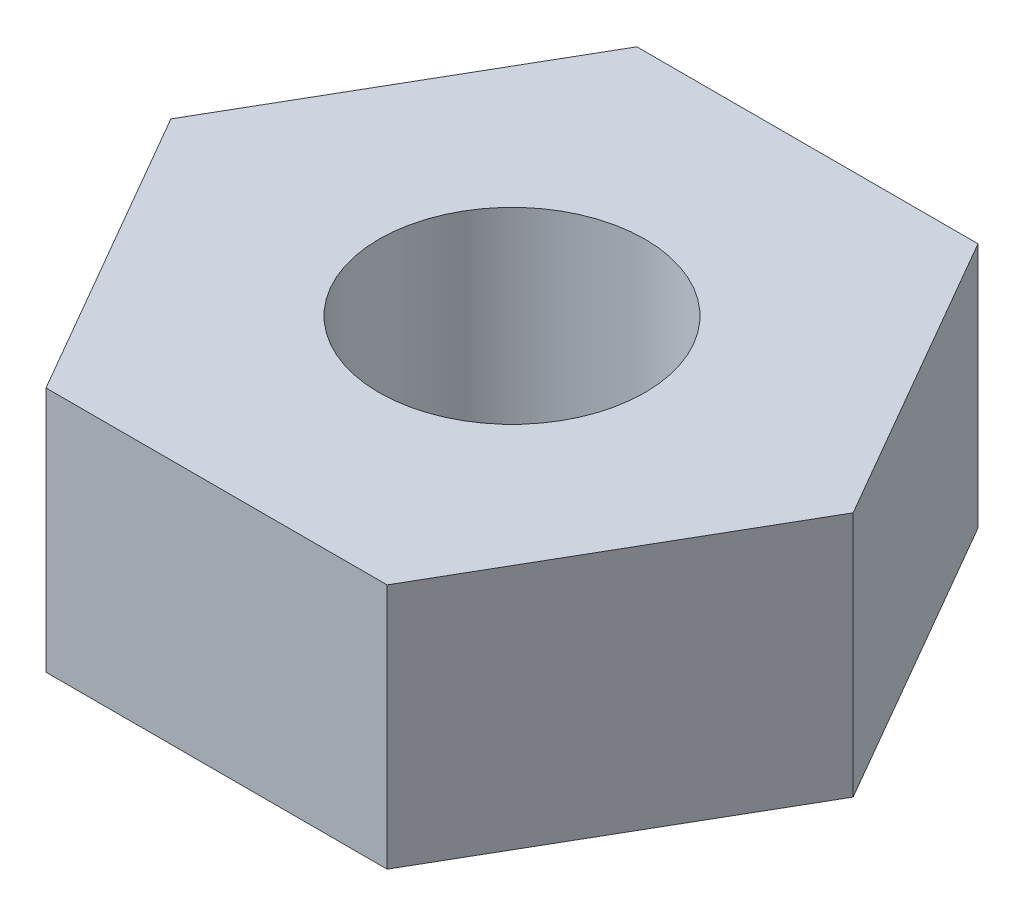
ISO-10303-21;
HEADER;
FILE_DESCRIPTION(('STEP AP214'),'2;1');
FILE_NAME('part.step','',(''),(''),'','','');
FILE_SCHEMA(('AUTOMOTIVE_DESIGN { 1 0 10303 214 1 1 1 1 }'));
ENDSEC;
DATA;
#1=APPLICATION_CONTEXT('core data for automotive mechanical design processes');
#2=APPLICATION_PROTOCOL_DEFINITION('international standard','automotive_design',2000,#1);
#3=PRODUCT_CONTEXT('',#1,'mechanical');
#4=PRODUCT('Part','Part','',(#3));
#5=PRODUCT_RELATED_PRODUCT_CATEGORY('part','',(#4));
#6=PRODUCT_DEFINITION_FORMATION('','',#4);
#7=PRODUCT_DEFINITION_CONTEXT('part definition',#1,'design');
#8=PRODUCT_DEFINITION('design','',#6,#7);
#9=PRODUCT_DEFINITION_SHAPE('','',#8);
#10=(LENGTH_UNIT() NAMED_UNIT(*) SI_UNIT(.MILLI.,.METRE.));
#11=(NAMED_UNIT(*) PLANE_ANGLE_UNIT() SI_UNIT($,.RADIAN.));
#12=(NAMED_UNIT(*) SI_UNIT($,.STERADIAN.) SOLID_ANGLE_UNIT());
#13=UNCERTAINTY_MEASURE_WITH_UNIT(LENGTH_MEASURE(1.E-05),#10,'distance_accuracy_value','');
#14=(GEOMETRIC_REPRESENTATION_CONTEXT(3) GLOBAL_UNCERTAINTY_ASSIGNED_CONTEXT((#13)) GLOBAL_UNIT_ASSIGNED_CONTEXT((#10,
#11,#12)) REPRESENTATION_CONTEXT('',''));
#15=CARTESIAN_POINT('',(0.,0.,0.));
#16=DIRECTION('',(0.,0.,1.));
#17=DIRECTION('',(1.,0.,0.));
#18=AXIS2_PLACEMENT_3D('',#15,#16,#17);
#19=CARTESIAN_POINT('',(0.,2.5,0.));
#20=DIRECTION('',(0.,1.,0.));
#21=DIRECTION('',(0.,0.,1.));
#22=AXIS2_PLACEMENT_3D('',#19,#20,#21);
#23=PLANE('',#22);
#24=DIRECTION('',(0.499999999999995,0.,-0.866025403784442));
#25=VECTOR('',#24,1.);
#26=CARTESIAN_POINT('',(1.73205080756891,2.5,2.99999999999998));
#27=LINE('',#26,#25);
#28=CARTESIAN_POINT('',(1.73205080756891,2.5,2.99999999999998));
#29=VERTEX_POINT('',#28);
#30=CARTESIAN_POINT('',(3.46410161513776,2.5,0.));
#31=VERTEX_POINT('',#30);
#32=EDGE_CURVE('E133',#29,#31,#27,.T.);
#33=ORIENTED_EDGE('',*,*,#32,.T.);
#34=DIRECTION('',(-0.500000000000001,0.,-0.866025403784438));
#35=VECTOR('',#34,1.);
#36=CARTESIAN_POINT('',(3.46410161513776,2.5,0.));
#37=LINE('',#36,#35);
#38=CARTESIAN_POINT('',(1.73205080756887,2.5,-3.00000000000001));
#39=VERTEX_POINT('',#38);
#40=EDGE_CURVE('E91',#31,#39,#37,.T.);
#41=ORIENTED_EDGE('',*,*,#40,.T.);
#42=DIRECTION('',(-1.,0.,0.));
#43=VECTOR('',#42,1.);
#44=CARTESIAN_POINT('',(1.73205080756887,2.5,-3.00000000000001));
#45=LINE('',#44,#43);
#46=CARTESIAN_POINT('',(-1.73205080756889,2.5,-2.99999999999999));
#47=VERTEX_POINT('',#46);
#48=EDGE_CURVE('E104',#39,#47,#45,.T.);
#49=ORIENTED_EDGE('',*,*,#48,.T.);
#50=DIRECTION('',(-0.499999999999995,0.,0.866025403784442));
#51=VECTOR('',#50,1.);
#52=CARTESIAN_POINT('',(-1.73205080756889,2.5,-2.99999999999999));
#53=LINE('',#52,#51);
#54=CARTESIAN_POINT('',(-3.46410161513776,2.5,0.));
#55=VERTEX_POINT('',#54);
#56=EDGE_CURVE('E98',#47,#55,#53,.T.);
#57=ORIENTED_EDGE('',*,*,#56,.T.);
#58=DIRECTION('',(0.500000000000007,0.,0.866025403784435));
#59=VECTOR('',#58,1.);
#60=CARTESIAN_POINT('',(-3.46410161513776,2.5,0.));
#61=LINE('',#60,#59);
#62=CARTESIAN_POINT('',(-1.73205080756885,2.5,3.00000000000002));
#63=VERTEX_POINT('',#62);
#64=EDGE_CURVE('E102',#55,#63,#61,.T.);
#65=ORIENTED_EDGE('',*,*,#64,.T.);
#66=DIRECTION('',(1.,0.,0.));
#67=VECTOR('',#66,1.);
#68=CARTESIAN_POINT('',(-1.73205080756885,2.5,3.00000000000002));
#69=LINE('',#68,#67);
#70=EDGE_CURVE('E54',#63,#29,#69,.T.);
#71=ORIENTED_EDGE('',*,*,#70,.T.);
#72=EDGE_LOOP('',(#33,#41,#49,#57,#65,#71));
#73=FACE_BOUND('',#72,.T.);
#74=CARTESIAN_POINT('',(0.,2.5,0.));
#75=DIRECTION('',(0.,1.,0.));
#76=DIRECTION('',(0.,0.,1.));
#77=AXIS2_PLACEMENT_3D('',#74,#75,#76);
#78=CIRCLE('',#77,1.35);
#79=CARTESIAN_POINT('',(0.,2.5,1.35));
#80=VERTEX_POINT('',#79);
#81=EDGE_CURVE('E126',#80,#80,#78,.T.);
#82=ORIENTED_EDGE('',*,*,#81,.F.);
#83=EDGE_LOOP('',(#82));
#84=FACE_BOUND('',#83,.T.);
#85=ADVANCED_FACE('F37',(#73,#84),#23,.T.);
#86=CARTESIAN_POINT('',(0.,0.,0.));
#87=DIRECTION('',(0.,1.,0.));
#88=DIRECTION('',(0.,0.,1.));
#89=AXIS2_PLACEMENT_3D('',#86,#87,#88);
#90=PLANE('',#89);
#91=DIRECTION('',(0.499999999999995,0.,-0.866025403784442));
#92=VECTOR('',#91,1.);
#93=CARTESIAN_POINT('',(1.73205080756891,0.,2.99999999999998));
#94=LINE('',#93,#92);
#95=CARTESIAN_POINT('',(1.73205080756891,0.,2.99999999999998));
#96=VERTEX_POINT('',#95);
#97=CARTESIAN_POINT('',(3.46410161513776,0.,0.));
#98=VERTEX_POINT('',#97);
#99=EDGE_CURVE('E122',#96,#98,#94,.T.);
#100=ORIENTED_EDGE('',*,*,#99,.F.);
#101=DIRECTION('',(1.,0.,0.));
#102=VECTOR('',#101,1.);
#103=CARTESIAN_POINT('',(-1.73205080756885,0.,3.00000000000002));
#104=LINE('',#103,#102);
#105=CARTESIAN_POINT('',(-1.73205080756885,0.,3.00000000000002));
#106=VERTEX_POINT('',#105);
#107=EDGE_CURVE('E83',#106,#96,#104,.T.);
#108=ORIENTED_EDGE('',*,*,#107,.F.);
#109=DIRECTION('',(0.500000000000007,0.,0.866025403784435));
#110=VECTOR('',#109,1.);
#111=CARTESIAN_POINT('',(-3.46410161513776,0.,0.));
#112=LINE('',#111,#110);
#113=CARTESIAN_POINT('',(-3.46410161513776,0.,0.));
#114=VERTEX_POINT('',#113);
#115=EDGE_CURVE('E77',#114,#106,#112,.T.);
#116=ORIENTED_EDGE('',*,*,#115,.F.);
#117=DIRECTION('',(-0.499999999999995,0.,0.866025403784442));
#118=VECTOR('',#117,1.);
#119=CARTESIAN_POINT('',(-1.73205080756889,0.,-2.99999999999999));
#120=LINE('',#119,#118);
#121=CARTESIAN_POINT('',(-1.73205080756889,0.,-2.99999999999999));
#122=VERTEX_POINT('',#121);
#123=EDGE_CURVE('E112',#122,#114,#120,.T.);
#124=ORIENTED_EDGE('',*,*,#123,.F.);
#125=DIRECTION('',(-1.,0.,0.));
#126=VECTOR('',#125,1.);
#127=CARTESIAN_POINT('',(1.73205080756887,0.,-3.00000000000001));
#128=LINE('',#127,#126);
#129=CARTESIAN_POINT('',(1.73205080756887,0.,-3.00000000000001));
#130=VERTEX_POINT('',#129);
#131=EDGE_CURVE('E128',#130,#122,#128,.T.);
#132=ORIENTED_EDGE('',*,*,#131,.F.);
#133=DIRECTION('',(-0.500000000000001,0.,-0.866025403784438));
#134=VECTOR('',#133,1.);
#135=CARTESIAN_POINT('',(3.46410161513776,0.,0.));
#136=LINE('',#135,#134);
#137=EDGE_CURVE('E125',#98,#130,#136,.T.);
#138=ORIENTED_EDGE('',*,*,#137,.F.);
#139=EDGE_LOOP('',(#100,#108,#116,#124,#132,#138));
#140=FACE_BOUND('',#139,.T.);
#141=CARTESIAN_POINT('',(0.,0.,0.));
#142=DIRECTION('',(0.,1.,0.));
#143=DIRECTION('',(0.,0.,1.));
#144=AXIS2_PLACEMENT_3D('',#141,#142,#143);
#145=CIRCLE('',#144,1.35);
#146=CARTESIAN_POINT('',(0.,0.,1.35));
#147=VERTEX_POINT('',#146);
#148=EDGE_CURVE('E226',#147,#147,#145,.T.);
#149=ORIENTED_EDGE('',*,*,#148,.T.);
#150=EDGE_LOOP('',(#149));
#151=FACE_BOUND('',#150,.T.);
#152=ADVANCED_FACE('F142',(#140,#151),#90,.F.);
#153=CARTESIAN_POINT('',(1.73205080756891,2.5,2.99999999999998));
#154=DIRECTION('',(-0.866025403784442,0.,-0.499999999999995));
#155=DIRECTION('',(-0.499999999999995,0.,0.866025403784442));
#156=AXIS2_PLACEMENT_3D('',#153,#154,#155);
#157=PLANE('',#156);
#158=ORIENTED_EDGE('',*,*,#99,.T.);
#159=DIRECTION('',(0.,-1.,0.));
#160=VECTOR('',#159,1.);
#161=CARTESIAN_POINT('',(3.46410161513776,2.5,0.));
#162=LINE('',#161,#160);
#163=EDGE_CURVE('E11',#31,#98,#162,.T.);
#164=ORIENTED_EDGE('',*,*,#163,.F.);
#165=ORIENTED_EDGE('',*,*,#32,.F.);
#166=DIRECTION('',(0.,-1.,0.));
#167=VECTOR('',#166,1.);
#168=CARTESIAN_POINT('',(1.73205080756891,2.5,2.99999999999998));
#169=LINE('',#168,#167);
#170=EDGE_CURVE('E118',#29,#96,#169,.T.);
#171=ORIENTED_EDGE('',*,*,#170,.T.);
#172=EDGE_LOOP('',(#158,#164,#165,#171));
#173=FACE_BOUND('',#172,.T.);
#174=ADVANCED_FACE('F39',(#173),#157,.F.);
#175=CARTESIAN_POINT('',(3.46410161513776,2.5,0.));
#176=DIRECTION('',(-0.866025403784438,0.,0.500000000000001));
#177=DIRECTION('',(0.500000000000001,0.,0.866025403784438));
#178=AXIS2_PLACEMENT_3D('',#175,#176,#177);
#179=PLANE('',#178);
#180=ORIENTED_EDGE('',*,*,#137,.T.);
#181=DIRECTION('',(0.,-1.,0.));
#182=VECTOR('',#181,1.);
#183=CARTESIAN_POINT('',(1.73205080756887,2.5,-3.00000000000001));
#184=LINE('',#183,#182);
#185=EDGE_CURVE('E46',#39,#130,#184,.T.);
#186=ORIENTED_EDGE('',*,*,#185,.F.);
#187=ORIENTED_EDGE('',*,*,#40,.F.);
#188=ORIENTED_EDGE('',*,*,#163,.T.);
#189=EDGE_LOOP('',(#180,#186,#187,#188));
#190=FACE_BOUND('',#189,.T.);
#191=ADVANCED_FACE('F167',(#190),#179,.F.);
#192=CARTESIAN_POINT('',(1.73205080756887,2.5,-3.00000000000001));
#193=DIRECTION('',(0.,0.,1.));
#194=DIRECTION('',(1.,0.,0.));
#195=AXIS2_PLACEMENT_3D('',#192,#193,#194);
#196=PLANE('',#195);
#197=ORIENTED_EDGE('',*,*,#131,.T.);
#198=DIRECTION('',(0.,-1.,0.));
#199=VECTOR('',#198,1.);
#200=CARTESIAN_POINT('',(-1.73205080756889,2.5,-2.99999999999999));
#201=LINE('',#200,#199);
#202=EDGE_CURVE('E113',#47,#122,#201,.T.);
#203=ORIENTED_EDGE('',*,*,#202,.F.);
#204=ORIENTED_EDGE('',*,*,#48,.F.);
#205=ORIENTED_EDGE('',*,*,#185,.T.);
#206=EDGE_LOOP('',(#197,#203,#204,#205));
#207=FACE_BOUND('',#206,.T.);
#208=ADVANCED_FACE('F139',(#207),#196,.F.);
#209=CARTESIAN_POINT('',(-1.73205080756889,2.5,-2.99999999999999));
#210=DIRECTION('',(0.866025403784442,0.,0.499999999999995));
#211=DIRECTION('',(0.499999999999995,0.,-0.866025403784442));
#212=AXIS2_PLACEMENT_3D('',#209,#210,#211);
#213=PLANE('',#212);
#214=ORIENTED_EDGE('',*,*,#123,.T.);
#215=DIRECTION('',(0.,-1.,0.));
#216=VECTOR('',#215,1.);
#217=CARTESIAN_POINT('',(-3.46410161513776,2.5,0.));
#218=LINE('',#217,#216);
#219=EDGE_CURVE('E109',#55,#114,#218,.T.);
#220=ORIENTED_EDGE('',*,*,#219,.F.);
#221=ORIENTED_EDGE('',*,*,#56,.F.);
#222=ORIENTED_EDGE('',*,*,#202,.T.);
#223=EDGE_LOOP('',(#214,#220,#221,#222));
#224=FACE_BOUND('',#223,.T.);
#225=ADVANCED_FACE('F110',(#224),#213,.F.);
#226=CARTESIAN_POINT('',(-3.46410161513776,2.5,0.));
#227=DIRECTION('',(0.866025403784435,0.,-0.500000000000007));
#228=DIRECTION('',(-0.500000000000007,0.,-0.866025403784435));
#229=AXIS2_PLACEMENT_3D('',#226,#227,#228);
#230=PLANE('',#229);
#231=ORIENTED_EDGE('',*,*,#115,.T.);
#232=DIRECTION('',(0.,-1.,0.));
#233=VECTOR('',#232,1.);
#234=CARTESIAN_POINT('',(-1.73205080756885,2.5,3.00000000000002));
#235=LINE('',#234,#233);
#236=EDGE_CURVE('E114',#63,#106,#235,.T.);
#237=ORIENTED_EDGE('',*,*,#236,.F.);
#238=ORIENTED_EDGE('',*,*,#64,.F.);
#239=ORIENTED_EDGE('',*,*,#219,.T.);
#240=EDGE_LOOP('',(#231,#237,#238,#239));
#241=FACE_BOUND('',#240,.T.);
#242=ADVANCED_FACE('F116',(#241),#230,.F.);
#243=CARTESIAN_POINT('',(-1.73205080756885,2.5,3.00000000000002));
#244=DIRECTION('',(0.,0.,-1.));
#245=DIRECTION('',(-1.,0.,0.));
#246=AXIS2_PLACEMENT_3D('',#243,#244,#245);
#247=PLANE('',#246);
#248=ORIENTED_EDGE('',*,*,#107,.T.);
#249=ORIENTED_EDGE('',*,*,#170,.F.);
#250=ORIENTED_EDGE('',*,*,#70,.F.);
#251=ORIENTED_EDGE('',*,*,#236,.T.);
#252=EDGE_LOOP('',(#248,#249,#250,#251));
#253=FACE_BOUND('',#252,.T.);
#254=ADVANCED_FACE('F147',(#253),#247,.F.);
#255=CARTESIAN_POINT('',(0.,2.5,0.));
#256=DIRECTION('',(0.,-1.,0.));
#257=DIRECTION('',(0.,0.,-1.));
#258=AXIS2_PLACEMENT_3D('',#255,#256,#257);
#259=CYLINDRICAL_SURFACE('',#258,1.35);
#260=ORIENTED_EDGE('',*,*,#81,.T.);
#261=EDGE_LOOP('',(#260));
#262=FACE_BOUND('',#261,.T.);
#263=ORIENTED_EDGE('',*,*,#148,.F.);
#264=EDGE_LOOP('',(#263));
#265=FACE_BOUND('',#264,.T.);
#266=ADVANCED_FACE('F149',(#262,#265),#259,.F.);
#267=CLOSED_SHELL('',(#85,#152,#174,#191,#208,#225,#242,#254,#266));
#268=MANIFOLD_SOLID_BREP('B2',#267);
#269=ADVANCED_BREP_SHAPE_REPRESENTATION('',(#18,#268),#14);
#270=SHAPE_DEFINITION_REPRESENTATION(#9,#269);
ENDSEC;
END-ISO-10303-21;
